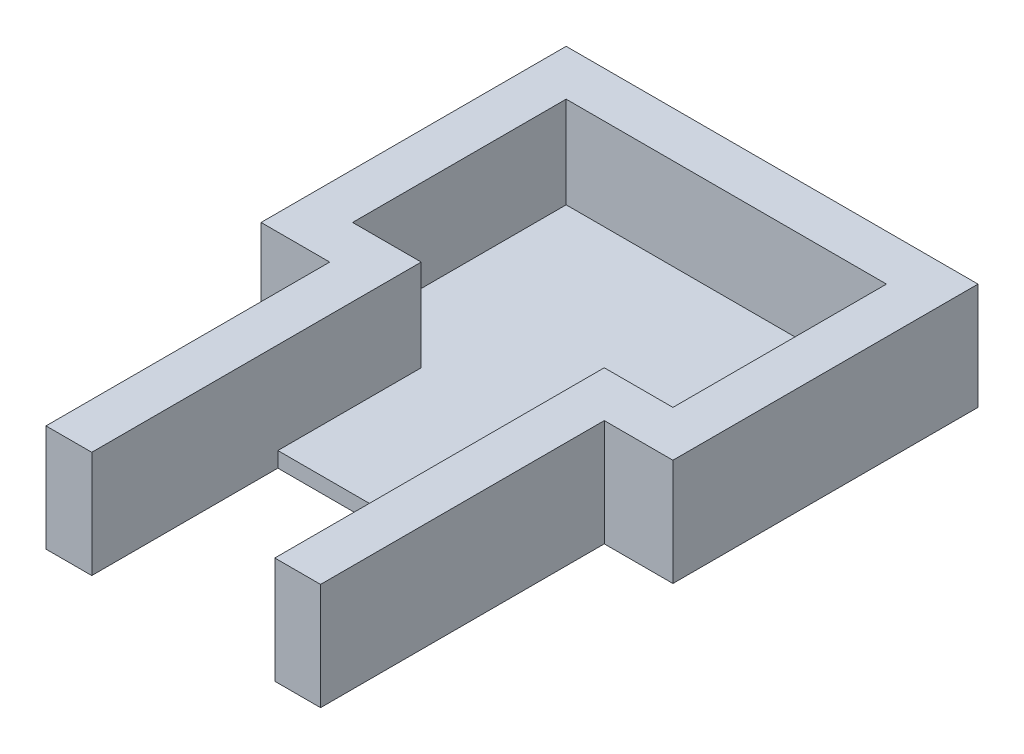
ISO-10303-21;
HEADER;
FILE_DESCRIPTION(('STEP AP214'),'2;1');
FILE_NAME('part.step','',(''),(''),'','','');
FILE_SCHEMA(('AUTOMOTIVE_DESIGN { 1 0 10303 214 1 1 1 1 }'));
ENDSEC;
DATA;
#1=APPLICATION_CONTEXT('core data for automotive mechanical design processes');
#2=APPLICATION_PROTOCOL_DEFINITION('international standard','automotive_design',2000,#1);
#3=PRODUCT_CONTEXT('',#1,'mechanical');
#4=PRODUCT('Part','Part','',(#3));
#5=PRODUCT_RELATED_PRODUCT_CATEGORY('part','',(#4));
#6=PRODUCT_DEFINITION_FORMATION('','',#4);
#7=PRODUCT_DEFINITION_CONTEXT('part definition',#1,'design');
#8=PRODUCT_DEFINITION('design','',#6,#7);
#9=PRODUCT_DEFINITION_SHAPE('','',#8);
#10=(LENGTH_UNIT() NAMED_UNIT(*) SI_UNIT(.MILLI.,.METRE.));
#11=(NAMED_UNIT(*) PLANE_ANGLE_UNIT() SI_UNIT($,.RADIAN.));
#12=(NAMED_UNIT(*) SI_UNIT($,.STERADIAN.) SOLID_ANGLE_UNIT());
#13=UNCERTAINTY_MEASURE_WITH_UNIT(LENGTH_MEASURE(1.E-05),#10,'distance_accuracy_value','');
#14=(GEOMETRIC_REPRESENTATION_CONTEXT(3) GLOBAL_UNCERTAINTY_ASSIGNED_CONTEXT((#13)) GLOBAL_UNIT_ASSIGNED_CONTEXT((#10,
#11,#12)) REPRESENTATION_CONTEXT('',''));
#15=CARTESIAN_POINT('',(0.,0.,0.));
#16=DIRECTION('',(0.,0.,1.));
#17=DIRECTION('',(1.,0.,0.));
#18=AXIS2_PLACEMENT_3D('',#15,#16,#17);
#19=CARTESIAN_POINT('',(45.,5.,143.));
#20=DIRECTION('',(0.,0.,-1.));
#21=DIRECTION('',(-1.,0.,0.));
#22=AXIS2_PLACEMENT_3D('',#19,#20,#21);
#23=PLANE('',#22);
#24=DIRECTION('',(0.,1.,0.));
#25=VECTOR('',#24,1.);
#26=CARTESIAN_POINT('',(-30.,0.,143.));
#27=LINE('',#26,#25);
#28=CARTESIAN_POINT('',(-30.,0.,143.));
#29=VERTEX_POINT('',#28);
#30=CARTESIAN_POINT('',(-30.,35.,143.));
#31=VERTEX_POINT('',#30);
#32=EDGE_CURVE('E201',#29,#31,#27,.T.);
#33=ORIENTED_EDGE('',*,*,#32,.T.);
#34=DIRECTION('',(1.,0.,0.));
#35=VECTOR('',#34,1.);
#36=CARTESIAN_POINT('',(-45.,35.,143.));
#37=LINE('',#36,#35);
#38=CARTESIAN_POINT('',(-45.,35.,143.));
#39=VERTEX_POINT('',#38);
#40=EDGE_CURVE('E288',#39,#31,#37,.T.);
#41=ORIENTED_EDGE('',*,*,#40,.F.);
#42=DIRECTION('',(0.,-1.,0.));
#43=VECTOR('',#42,1.);
#44=CARTESIAN_POINT('',(-45.,5.,143.));
#45=LINE('',#44,#43);
#46=CARTESIAN_POINT('',(-45.,0.,143.));
#47=VERTEX_POINT('',#46);
#48=EDGE_CURVE('E350',#39,#47,#45,.T.);
#49=ORIENTED_EDGE('',*,*,#48,.T.);
#50=DIRECTION('',(1.,0.,0.));
#51=VECTOR('',#50,1.);
#52=CARTESIAN_POINT('',(45.,0.,143.));
#53=LINE('',#52,#51);
#54=EDGE_CURVE('E314',#47,#29,#53,.T.);
#55=ORIENTED_EDGE('',*,*,#54,.T.);
#56=EDGE_LOOP('',(#33,#41,#49,#55));
#57=FACE_BOUND('',#56,.T.);
#58=ADVANCED_FACE('F43',(#57),#23,.F.);
#59=CARTESIAN_POINT('',(0.,5.,0.));
#60=DIRECTION('',(0.,1.,0.));
#61=DIRECTION('',(0.,0.,1.));
#62=AXIS2_PLACEMENT_3D('',#59,#60,#61);
#63=PLANE('',#62);
#64=DIRECTION('',(0.,0.,1.));
#65=VECTOR('',#64,1.);
#66=CARTESIAN_POINT('',(-30.,5.,35.));
#67=LINE('',#66,#65);
#68=CARTESIAN_POINT('',(-30.,5.,35.));
#69=VERTEX_POINT('',#68);
#70=CARTESIAN_POINT('',(-30.,5.,82.));
#71=VERTEX_POINT('',#70);
#72=EDGE_CURVE('E241',#69,#71,#67,.T.);
#73=ORIENTED_EDGE('',*,*,#72,.T.);
#74=DIRECTION('',(1.,0.,0.));
#75=VECTOR('',#74,1.);
#76=CARTESIAN_POINT('',(0.,5.,82.));
#77=LINE('',#76,#75);
#78=CARTESIAN_POINT('',(30.,5.,82.));
#79=VERTEX_POINT('',#78);
#80=EDGE_CURVE('E11',#71,#79,#77,.T.);
#81=ORIENTED_EDGE('',*,*,#80,.T.);
#82=DIRECTION('',(0.,0.,-1.));
#83=VECTOR('',#82,1.);
#84=CARTESIAN_POINT('',(30.,5.,128.));
#85=LINE('',#84,#83);
#86=CARTESIAN_POINT('',(30.,5.,35.));
#87=VERTEX_POINT('',#86);
#88=EDGE_CURVE('E185',#79,#87,#85,.T.);
#89=ORIENTED_EDGE('',*,*,#88,.T.);
#90=DIRECTION('',(1.,0.,0.));
#91=VECTOR('',#90,1.);
#92=CARTESIAN_POINT('',(30.,5.,35.));
#93=LINE('',#92,#91);
#94=CARTESIAN_POINT('',(52.5,5.,35.));
#95=VERTEX_POINT('',#94);
#96=EDGE_CURVE('E211',#87,#95,#93,.T.);
#97=ORIENTED_EDGE('',*,*,#96,.T.);
#98=DIRECTION('',(0.,0.,-1.));
#99=VECTOR('',#98,1.);
#100=CARTESIAN_POINT('',(52.5,5.,35.));
#101=LINE('',#100,#99);
#102=CARTESIAN_POINT('',(52.5,5.,-35.));
#103=VERTEX_POINT('',#102);
#104=EDGE_CURVE('E67',#95,#103,#101,.T.);
#105=ORIENTED_EDGE('',*,*,#104,.T.);
#106=DIRECTION('',(-1.,0.,0.));
#107=VECTOR('',#106,1.);
#108=CARTESIAN_POINT('',(52.5,5.,-35.));
#109=LINE('',#108,#107);
#110=CARTESIAN_POINT('',(-52.5,5.,-35.));
#111=VERTEX_POINT('',#110);
#112=EDGE_CURVE('E232',#103,#111,#109,.T.);
#113=ORIENTED_EDGE('',*,*,#112,.T.);
#114=DIRECTION('',(0.,0.,1.));
#115=VECTOR('',#114,1.);
#116=CARTESIAN_POINT('',(-52.5,5.,-35.));
#117=LINE('',#116,#115);
#118=CARTESIAN_POINT('',(-52.5,5.,35.));
#119=VERTEX_POINT('',#118);
#120=EDGE_CURVE('E235',#111,#119,#117,.T.);
#121=ORIENTED_EDGE('',*,*,#120,.T.);
#122=DIRECTION('',(1.,0.,0.));
#123=VECTOR('',#122,1.);
#124=CARTESIAN_POINT('',(-52.5,5.,35.));
#125=LINE('',#124,#123);
#126=EDGE_CURVE('E238',#119,#69,#125,.T.);
#127=ORIENTED_EDGE('',*,*,#126,.T.);
#128=EDGE_LOOP('',(#73,#81,#89,#97,#105,#113,#121,#127));
#129=FACE_BOUND('',#128,.T.);
#130=ADVANCED_FACE('F413',(#129),#63,.T.);
#131=CARTESIAN_POINT('',(-67.5,5.,50.));
#132=DIRECTION('',(1.,0.,0.));
#133=DIRECTION('',(0.,0.,-1.));
#134=AXIS2_PLACEMENT_3D('',#131,#132,#133);
#135=PLANE('',#134);
#136=DIRECTION('',(0.,0.,1.));
#137=VECTOR('',#136,1.);
#138=CARTESIAN_POINT('',(-67.5,0.,50.));
#139=LINE('',#138,#137);
#140=CARTESIAN_POINT('',(-67.5,0.,-50.));
#141=VERTEX_POINT('',#140);
#142=CARTESIAN_POINT('',(-67.5,0.,50.));
#143=VERTEX_POINT('',#142);
#144=EDGE_CURVE('E304',#141,#143,#139,.T.);
#145=ORIENTED_EDGE('',*,*,#144,.T.);
#146=DIRECTION('',(0.,-1.,0.));
#147=VECTOR('',#146,1.);
#148=CARTESIAN_POINT('',(-67.5,5.,50.));
#149=LINE('',#148,#147);
#150=CARTESIAN_POINT('',(-67.5,35.,50.));
#151=VERTEX_POINT('',#150);
#152=EDGE_CURVE('E52',#151,#143,#149,.T.);
#153=ORIENTED_EDGE('',*,*,#152,.F.);
#154=DIRECTION('',(0.,0.,1.));
#155=VECTOR('',#154,1.);
#156=CARTESIAN_POINT('',(-67.5,35.,-50.));
#157=LINE('',#156,#155);
#158=CARTESIAN_POINT('',(-67.5,35.,-50.));
#159=VERTEX_POINT('',#158);
#160=EDGE_CURVE('E275',#159,#151,#157,.T.);
#161=ORIENTED_EDGE('',*,*,#160,.F.);
#162=DIRECTION('',(0.,-1.,0.));
#163=VECTOR('',#162,1.);
#164=CARTESIAN_POINT('',(-67.5,5.,-50.));
#165=LINE('',#164,#163);
#166=EDGE_CURVE('E330',#159,#141,#165,.T.);
#167=ORIENTED_EDGE('',*,*,#166,.T.);
#168=EDGE_LOOP('',(#145,#153,#161,#167));
#169=FACE_BOUND('',#168,.T.);
#170=ADVANCED_FACE('F45',(#169),#135,.F.);
#171=CARTESIAN_POINT('',(-45.,5.,50.));
#172=DIRECTION('',(0.,0.,-1.));
#173=DIRECTION('',(-1.,0.,0.));
#174=AXIS2_PLACEMENT_3D('',#171,#172,#173);
#175=PLANE('',#174);
#176=DIRECTION('',(1.,0.,0.));
#177=VECTOR('',#176,1.);
#178=CARTESIAN_POINT('',(-45.,0.,50.));
#179=LINE('',#178,#177);
#180=CARTESIAN_POINT('',(-45.,0.,50.));
#181=VERTEX_POINT('',#180);
#182=EDGE_CURVE('E308',#143,#181,#179,.T.);
#183=ORIENTED_EDGE('',*,*,#182,.T.);
#184=DIRECTION('',(0.,-1.,0.));
#185=VECTOR('',#184,1.);
#186=CARTESIAN_POINT('',(-45.,5.,50.));
#187=LINE('',#186,#185);
#188=CARTESIAN_POINT('',(-45.,35.,50.));
#189=VERTEX_POINT('',#188);
#190=EDGE_CURVE('E354',#189,#181,#187,.T.);
#191=ORIENTED_EDGE('',*,*,#190,.F.);
#192=DIRECTION('',(1.,0.,0.));
#193=VECTOR('',#192,1.);
#194=CARTESIAN_POINT('',(-67.5,35.,50.));
#195=LINE('',#194,#193);
#196=EDGE_CURVE('E279',#151,#189,#195,.T.);
#197=ORIENTED_EDGE('',*,*,#196,.F.);
#198=ORIENTED_EDGE('',*,*,#152,.T.);
#199=EDGE_LOOP('',(#183,#191,#197,#198));
#200=FACE_BOUND('',#199,.T.);
#201=ADVANCED_FACE('F361',(#200),#175,.F.);
#202=CARTESIAN_POINT('',(-45.,5.,143.));
#203=DIRECTION('',(1.,0.,0.));
#204=DIRECTION('',(0.,0.,-1.));
#205=AXIS2_PLACEMENT_3D('',#202,#203,#204);
#206=PLANE('',#205);
#207=DIRECTION('',(0.,0.,1.));
#208=VECTOR('',#207,1.);
#209=CARTESIAN_POINT('',(-45.,0.,143.));
#210=LINE('',#209,#208);
#211=EDGE_CURVE('E311',#181,#47,#210,.T.);
#212=ORIENTED_EDGE('',*,*,#211,.T.);
#213=ORIENTED_EDGE('',*,*,#48,.F.);
#214=DIRECTION('',(0.,0.,1.));
#215=VECTOR('',#214,1.);
#216=CARTESIAN_POINT('',(-45.,35.,50.));
#217=LINE('',#216,#215);
#218=EDGE_CURVE('E283',#189,#39,#217,.T.);
#219=ORIENTED_EDGE('',*,*,#218,.F.);
#220=ORIENTED_EDGE('',*,*,#190,.T.);
#221=EDGE_LOOP('',(#212,#213,#219,#220));
#222=FACE_BOUND('',#221,.T.);
#223=ADVANCED_FACE('F370',(#222),#206,.F.);
#224=CARTESIAN_POINT('',(30.,35.,143.));
#225=VERTEX_POINT('',#224);
#226=CARTESIAN_POINT('',(45.,35.,143.));
#227=VERTEX_POINT('',#226);
#228=EDGE_CURVE('E287',#225,#227,#37,.T.);
#229=ORIENTED_EDGE('',*,*,#228,.F.);
#230=DIRECTION('',(0.,1.,0.));
#231=VECTOR('',#230,1.);
#232=CARTESIAN_POINT('',(30.,0.,143.));
#233=LINE('',#232,#231);
#234=CARTESIAN_POINT('',(30.,0.,143.));
#235=VERTEX_POINT('',#234);
#236=EDGE_CURVE('E187',#235,#225,#233,.T.);
#237=ORIENTED_EDGE('',*,*,#236,.F.);
#238=CARTESIAN_POINT('',(45.,0.,143.));
#239=VERTEX_POINT('',#238);
#240=EDGE_CURVE('E192',#235,#239,#53,.T.);
#241=ORIENTED_EDGE('',*,*,#240,.T.);
#242=DIRECTION('',(0.,-1.,0.));
#243=VECTOR('',#242,1.);
#244=CARTESIAN_POINT('',(45.,5.,143.));
#245=LINE('',#244,#243);
#246=EDGE_CURVE('E346',#227,#239,#245,.T.);
#247=ORIENTED_EDGE('',*,*,#246,.F.);
#248=EDGE_LOOP('',(#229,#237,#241,#247));
#249=FACE_BOUND('',#248,.T.);
#250=ADVANCED_FACE('F396',(#249),#23,.F.);
#251=CARTESIAN_POINT('',(45.,5.,143.));
#252=DIRECTION('',(-1.,0.,0.));
#253=DIRECTION('',(0.,0.,1.));
#254=AXIS2_PLACEMENT_3D('',#251,#252,#253);
#255=PLANE('',#254);
#256=DIRECTION('',(0.,0.,-1.));
#257=VECTOR('',#256,1.);
#258=CARTESIAN_POINT('',(45.,0.,143.));
#259=LINE('',#258,#257);
#260=CARTESIAN_POINT('',(45.,0.,50.));
#261=VERTEX_POINT('',#260);
#262=EDGE_CURVE('E318',#239,#261,#259,.T.);
#263=ORIENTED_EDGE('',*,*,#262,.T.);
#264=DIRECTION('',(0.,-1.,0.));
#265=VECTOR('',#264,1.);
#266=CARTESIAN_POINT('',(45.,5.,50.));
#267=LINE('',#266,#265);
#268=CARTESIAN_POINT('',(45.,35.,50.));
#269=VERTEX_POINT('',#268);
#270=EDGE_CURVE('E342',#269,#261,#267,.T.);
#271=ORIENTED_EDGE('',*,*,#270,.F.);
#272=DIRECTION('',(0.,0.,-1.));
#273=VECTOR('',#272,1.);
#274=CARTESIAN_POINT('',(45.,35.,143.));
#275=LINE('',#274,#273);
#276=EDGE_CURVE('E292',#227,#269,#275,.T.);
#277=ORIENTED_EDGE('',*,*,#276,.F.);
#278=ORIENTED_EDGE('',*,*,#246,.T.);
#279=EDGE_LOOP('',(#263,#271,#277,#278));
#280=FACE_BOUND('',#279,.T.);
#281=ADVANCED_FACE('F390',(#280),#255,.F.);
#282=CARTESIAN_POINT('',(67.5,5.,50.));
#283=DIRECTION('',(0.,0.,-1.));
#284=DIRECTION('',(-1.,0.,0.));
#285=AXIS2_PLACEMENT_3D('',#282,#283,#284);
#286=PLANE('',#285);
#287=DIRECTION('',(1.,0.,0.));
#288=VECTOR('',#287,1.);
#289=CARTESIAN_POINT('',(67.5,0.,50.));
#290=LINE('',#289,#288);
#291=CARTESIAN_POINT('',(67.5,0.,50.));
#292=VERTEX_POINT('',#291);
#293=EDGE_CURVE('E321',#261,#292,#290,.T.);
#294=ORIENTED_EDGE('',*,*,#293,.T.);
#295=DIRECTION('',(0.,-1.,0.));
#296=VECTOR('',#295,1.);
#297=CARTESIAN_POINT('',(67.5,5.,50.));
#298=LINE('',#297,#296);
#299=CARTESIAN_POINT('',(67.5,35.,50.));
#300=VERTEX_POINT('',#299);
#301=EDGE_CURVE('E338',#300,#292,#298,.T.);
#302=ORIENTED_EDGE('',*,*,#301,.F.);
#303=DIRECTION('',(1.,0.,0.));
#304=VECTOR('',#303,1.);
#305=CARTESIAN_POINT('',(45.,35.,50.));
#306=LINE('',#305,#304);
#307=EDGE_CURVE('E296',#269,#300,#306,.T.);
#308=ORIENTED_EDGE('',*,*,#307,.F.);
#309=ORIENTED_EDGE('',*,*,#270,.T.);
#310=EDGE_LOOP('',(#294,#302,#308,#309));
#311=FACE_BOUND('',#310,.T.);
#312=ADVANCED_FACE('F386',(#311),#286,.F.);
#313=CARTESIAN_POINT('',(67.5,5.,50.));
#314=DIRECTION('',(-1.,0.,0.));
#315=DIRECTION('',(0.,0.,1.));
#316=AXIS2_PLACEMENT_3D('',#313,#314,#315);
#317=PLANE('',#316);
#318=DIRECTION('',(0.,0.,-1.));
#319=VECTOR('',#318,1.);
#320=CARTESIAN_POINT('',(67.5,0.,50.));
#321=LINE('',#320,#319);
#322=CARTESIAN_POINT('',(67.5,0.,-50.));
#323=VERTEX_POINT('',#322);
#324=EDGE_CURVE('E324',#292,#323,#321,.T.);
#325=ORIENTED_EDGE('',*,*,#324,.T.);
#326=DIRECTION('',(0.,-1.,0.));
#327=VECTOR('',#326,1.);
#328=CARTESIAN_POINT('',(67.5,5.,-50.));
#329=LINE('',#328,#327);
#330=CARTESIAN_POINT('',(67.5,35.,-50.));
#331=VERTEX_POINT('',#330);
#332=EDGE_CURVE('E334',#331,#323,#329,.T.);
#333=ORIENTED_EDGE('',*,*,#332,.F.);
#334=DIRECTION('',(0.,0.,-1.));
#335=VECTOR('',#334,1.);
#336=CARTESIAN_POINT('',(67.5,35.,50.));
#337=LINE('',#336,#335);
#338=EDGE_CURVE('E300',#300,#331,#337,.T.);
#339=ORIENTED_EDGE('',*,*,#338,.F.);
#340=ORIENTED_EDGE('',*,*,#301,.T.);
#341=EDGE_LOOP('',(#325,#333,#339,#340));
#342=FACE_BOUND('',#341,.T.);
#343=ADVANCED_FACE('F383',(#342),#317,.F.);
#344=CARTESIAN_POINT('',(67.5,5.,-50.));
#345=DIRECTION('',(0.,0.,1.));
#346=DIRECTION('',(1.,0.,0.));
#347=AXIS2_PLACEMENT_3D('',#344,#345,#346);
#348=PLANE('',#347);
#349=DIRECTION('',(-1.,0.,0.));
#350=VECTOR('',#349,1.);
#351=CARTESIAN_POINT('',(67.5,0.,-50.));
#352=LINE('',#351,#350);
#353=EDGE_CURVE('E327',#323,#141,#352,.T.);
#354=ORIENTED_EDGE('',*,*,#353,.T.);
#355=ORIENTED_EDGE('',*,*,#166,.F.);
#356=DIRECTION('',(-1.,0.,0.));
#357=VECTOR('',#356,1.);
#358=CARTESIAN_POINT('',(67.5,35.,-50.));
#359=LINE('',#358,#357);
#360=EDGE_CURVE('E271',#331,#159,#359,.T.);
#361=ORIENTED_EDGE('',*,*,#360,.F.);
#362=ORIENTED_EDGE('',*,*,#332,.T.);
#363=EDGE_LOOP('',(#354,#355,#361,#362));
#364=FACE_BOUND('',#363,.T.);
#365=ADVANCED_FACE('F381',(#364),#348,.F.);
#366=CARTESIAN_POINT('',(0.,0.,0.));
#367=DIRECTION('',(0.,1.,0.));
#368=DIRECTION('',(0.,0.,1.));
#369=AXIS2_PLACEMENT_3D('',#366,#367,#368);
#370=PLANE('',#369);
#371=ORIENTED_EDGE('',*,*,#240,.F.);
#372=DIRECTION('',(0.,0.,-1.));
#373=VECTOR('',#372,1.);
#374=CARTESIAN_POINT('',(30.,0.,143.));
#375=LINE('',#374,#373);
#376=CARTESIAN_POINT('',(30.,0.,82.));
#377=VERTEX_POINT('',#376);
#378=EDGE_CURVE('E177',#235,#377,#375,.T.);
#379=ORIENTED_EDGE('',*,*,#378,.T.);
#380=DIRECTION('',(1.,0.,0.));
#381=VECTOR('',#380,1.);
#382=CARTESIAN_POINT('',(-30.,0.,82.));
#383=LINE('',#382,#381);
#384=CARTESIAN_POINT('',(-30.,0.,82.));
#385=VERTEX_POINT('',#384);
#386=EDGE_CURVE('E169',#385,#377,#383,.T.);
#387=ORIENTED_EDGE('',*,*,#386,.F.);
#388=DIRECTION('',(0.,0.,-1.));
#389=VECTOR('',#388,1.);
#390=CARTESIAN_POINT('',(-30.,0.,143.));
#391=LINE('',#390,#389);
#392=EDGE_CURVE('E194',#29,#385,#391,.T.);
#393=ORIENTED_EDGE('',*,*,#392,.F.);
#394=ORIENTED_EDGE('',*,*,#54,.F.);
#395=ORIENTED_EDGE('',*,*,#211,.F.);
#396=ORIENTED_EDGE('',*,*,#182,.F.);
#397=ORIENTED_EDGE('',*,*,#144,.F.);
#398=ORIENTED_EDGE('',*,*,#353,.F.);
#399=ORIENTED_EDGE('',*,*,#324,.F.);
#400=ORIENTED_EDGE('',*,*,#293,.F.);
#401=ORIENTED_EDGE('',*,*,#262,.F.);
#402=EDGE_LOOP('',(#371,#379,#387,#393,#394,#395,#396,#397,#398,#399,#400,#401));
#403=FACE_BOUND('',#402,.T.);
#404=ADVANCED_FACE('F190',(#403),#370,.F.);
#405=CARTESIAN_POINT('',(0.,35.,0.));
#406=DIRECTION('',(0.,1.,0.));
#407=DIRECTION('',(0.,0.,1.));
#408=AXIS2_PLACEMENT_3D('',#405,#406,#407);
#409=PLANE('',#408);
#410=DIRECTION('',(0.,0.,-1.));
#411=VECTOR('',#410,1.);
#412=CARTESIAN_POINT('',(30.,35.,128.));
#413=LINE('',#412,#411);
#414=CARTESIAN_POINT('',(30.,35.,35.));
#415=VERTEX_POINT('',#414);
#416=EDGE_CURVE('E223',#225,#415,#413,.T.);
#417=ORIENTED_EDGE('',*,*,#416,.F.);
#418=ORIENTED_EDGE('',*,*,#228,.T.);
#419=ORIENTED_EDGE('',*,*,#276,.T.);
#420=ORIENTED_EDGE('',*,*,#307,.T.);
#421=ORIENTED_EDGE('',*,*,#338,.T.);
#422=ORIENTED_EDGE('',*,*,#360,.T.);
#423=ORIENTED_EDGE('',*,*,#160,.T.);
#424=ORIENTED_EDGE('',*,*,#196,.T.);
#425=ORIENTED_EDGE('',*,*,#218,.T.);
#426=ORIENTED_EDGE('',*,*,#40,.T.);
#427=DIRECTION('',(0.,0.,1.));
#428=VECTOR('',#427,1.);
#429=CARTESIAN_POINT('',(-30.,35.,35.));
#430=LINE('',#429,#428);
#431=CARTESIAN_POINT('',(-30.,35.,35.));
#432=VERTEX_POINT('',#431);
#433=EDGE_CURVE('E220',#432,#31,#430,.T.);
#434=ORIENTED_EDGE('',*,*,#433,.F.);
#435=DIRECTION('',(1.,0.,0.));
#436=VECTOR('',#435,1.);
#437=CARTESIAN_POINT('',(-52.5,35.,35.));
#438=LINE('',#437,#436);
#439=CARTESIAN_POINT('',(-52.5,35.,35.));
#440=VERTEX_POINT('',#439);
#441=EDGE_CURVE('E217',#440,#432,#438,.T.);
#442=ORIENTED_EDGE('',*,*,#441,.F.);
#443=DIRECTION('',(0.,0.,1.));
#444=VECTOR('',#443,1.);
#445=CARTESIAN_POINT('',(-52.5,35.,-35.));
#446=LINE('',#445,#444);
#447=CARTESIAN_POINT('',(-52.5,35.,-35.));
#448=VERTEX_POINT('',#447);
#449=EDGE_CURVE('E214',#448,#440,#446,.T.);
#450=ORIENTED_EDGE('',*,*,#449,.F.);
#451=DIRECTION('',(-1.,0.,0.));
#452=VECTOR('',#451,1.);
#453=CARTESIAN_POINT('',(52.5,35.,-35.));
#454=LINE('',#453,#452);
#455=CARTESIAN_POINT('',(52.5,35.,-35.));
#456=VERTEX_POINT('',#455);
#457=EDGE_CURVE('E210',#456,#448,#454,.T.);
#458=ORIENTED_EDGE('',*,*,#457,.F.);
#459=DIRECTION('',(0.,0.,-1.));
#460=VECTOR('',#459,1.);
#461=CARTESIAN_POINT('',(52.5,35.,35.));
#462=LINE('',#461,#460);
#463=CARTESIAN_POINT('',(52.5,35.,35.));
#464=VERTEX_POINT('',#463);
#465=EDGE_CURVE('E207',#464,#456,#462,.T.);
#466=ORIENTED_EDGE('',*,*,#465,.F.);
#467=DIRECTION('',(1.,0.,0.));
#468=VECTOR('',#467,1.);
#469=CARTESIAN_POINT('',(30.,35.,35.));
#470=LINE('',#469,#468);
#471=EDGE_CURVE('E226',#415,#464,#470,.T.);
#472=ORIENTED_EDGE('',*,*,#471,.F.);
#473=EDGE_LOOP('',(#417,#418,#419,#420,#421,#422,#423,#424,#425,#426,#434,#442,#450,#458,#466,#472));
#474=FACE_BOUND('',#473,.T.);
#475=ADVANCED_FACE('F376',(#474),#409,.T.);
#476=CARTESIAN_POINT('',(52.5,35.,35.));
#477=DIRECTION('',(-1.,0.,0.));
#478=DIRECTION('',(0.,0.,1.));
#479=AXIS2_PLACEMENT_3D('',#476,#477,#478);
#480=PLANE('',#479);
#481=ORIENTED_EDGE('',*,*,#104,.F.);
#482=DIRECTION('',(0.,-1.,0.));
#483=VECTOR('',#482,1.);
#484=CARTESIAN_POINT('',(52.5,35.,35.));
#485=LINE('',#484,#483);
#486=EDGE_CURVE('E229',#464,#95,#485,.T.);
#487=ORIENTED_EDGE('',*,*,#486,.F.);
#488=ORIENTED_EDGE('',*,*,#465,.T.);
#489=DIRECTION('',(0.,-1.,0.));
#490=VECTOR('',#489,1.);
#491=CARTESIAN_POINT('',(52.5,35.,-35.));
#492=LINE('',#491,#490);
#493=EDGE_CURVE('E267',#456,#103,#492,.T.);
#494=ORIENTED_EDGE('',*,*,#493,.T.);
#495=EDGE_LOOP('',(#481,#487,#488,#494));
#496=FACE_BOUND('',#495,.T.);
#497=ADVANCED_FACE('F408',(#496),#480,.T.);
#498=CARTESIAN_POINT('',(52.5,35.,-35.));
#499=DIRECTION('',(0.,0.,1.));
#500=DIRECTION('',(1.,0.,0.));
#501=AXIS2_PLACEMENT_3D('',#498,#499,#500);
#502=PLANE('',#501);
#503=ORIENTED_EDGE('',*,*,#112,.F.);
#504=ORIENTED_EDGE('',*,*,#493,.F.);
#505=ORIENTED_EDGE('',*,*,#457,.T.);
#506=DIRECTION('',(0.,-1.,0.));
#507=VECTOR('',#506,1.);
#508=CARTESIAN_POINT('',(-52.5,35.,-35.));
#509=LINE('',#508,#507);
#510=EDGE_CURVE('E263',#448,#111,#509,.T.);
#511=ORIENTED_EDGE('',*,*,#510,.T.);
#512=EDGE_LOOP('',(#503,#504,#505,#511));
#513=FACE_BOUND('',#512,.T.);
#514=ADVANCED_FACE('F410',(#513),#502,.T.);
#515=CARTESIAN_POINT('',(-52.5,35.,-35.));
#516=DIRECTION('',(1.,0.,0.));
#517=DIRECTION('',(0.,0.,-1.));
#518=AXIS2_PLACEMENT_3D('',#515,#516,#517);
#519=PLANE('',#518);
#520=ORIENTED_EDGE('',*,*,#120,.F.);
#521=ORIENTED_EDGE('',*,*,#510,.F.);
#522=ORIENTED_EDGE('',*,*,#449,.T.);
#523=DIRECTION('',(0.,-1.,0.));
#524=VECTOR('',#523,1.);
#525=CARTESIAN_POINT('',(-52.5,35.,35.));
#526=LINE('',#525,#524);
#527=EDGE_CURVE('E259',#440,#119,#526,.T.);
#528=ORIENTED_EDGE('',*,*,#527,.T.);
#529=EDGE_LOOP('',(#520,#521,#522,#528));
#530=FACE_BOUND('',#529,.T.);
#531=ADVANCED_FACE('F417',(#530),#519,.T.);
#532=CARTESIAN_POINT('',(-52.5,35.,35.));
#533=DIRECTION('',(0.,0.,-1.));
#534=DIRECTION('',(-1.,0.,0.));
#535=AXIS2_PLACEMENT_3D('',#532,#533,#534);
#536=PLANE('',#535);
#537=ORIENTED_EDGE('',*,*,#126,.F.);
#538=ORIENTED_EDGE('',*,*,#527,.F.);
#539=ORIENTED_EDGE('',*,*,#441,.T.);
#540=DIRECTION('',(0.,-1.,0.));
#541=VECTOR('',#540,1.);
#542=CARTESIAN_POINT('',(-30.,35.,35.));
#543=LINE('',#542,#541);
#544=EDGE_CURVE('E255',#432,#69,#543,.T.);
#545=ORIENTED_EDGE('',*,*,#544,.T.);
#546=EDGE_LOOP('',(#537,#538,#539,#545));
#547=FACE_BOUND('',#546,.T.);
#548=ADVANCED_FACE('F419',(#547),#536,.T.);
#549=CARTESIAN_POINT('',(-30.,35.,35.));
#550=DIRECTION('',(1.,0.,0.));
#551=DIRECTION('',(0.,0.,-1.));
#552=AXIS2_PLACEMENT_3D('',#549,#550,#551);
#553=PLANE('',#552);
#554=DIRECTION('',(0.,1.,0.));
#555=VECTOR('',#554,1.);
#556=CARTESIAN_POINT('',(-30.,0.,82.));
#557=LINE('',#556,#555);
#558=EDGE_CURVE('E59',#385,#71,#557,.T.);
#559=ORIENTED_EDGE('',*,*,#558,.T.);
#560=ORIENTED_EDGE('',*,*,#72,.F.);
#561=ORIENTED_EDGE('',*,*,#544,.F.);
#562=ORIENTED_EDGE('',*,*,#433,.T.);
#563=ORIENTED_EDGE('',*,*,#32,.F.);
#564=ORIENTED_EDGE('',*,*,#392,.T.);
#565=EDGE_LOOP('',(#559,#560,#561,#562,#563,#564));
#566=FACE_BOUND('',#565,.T.);
#567=ADVANCED_FACE('F421',(#566),#553,.T.);
#568=CARTESIAN_POINT('',(30.,35.,128.));
#569=DIRECTION('',(-1.,0.,0.));
#570=DIRECTION('',(0.,0.,1.));
#571=AXIS2_PLACEMENT_3D('',#568,#569,#570);
#572=PLANE('',#571);
#573=ORIENTED_EDGE('',*,*,#416,.T.);
#574=DIRECTION('',(0.,-1.,0.));
#575=VECTOR('',#574,1.);
#576=CARTESIAN_POINT('',(30.,35.,35.));
#577=LINE('',#576,#575);
#578=EDGE_CURVE('E252',#415,#87,#577,.T.);
#579=ORIENTED_EDGE('',*,*,#578,.T.);
#580=ORIENTED_EDGE('',*,*,#88,.F.);
#581=DIRECTION('',(0.,1.,0.));
#582=VECTOR('',#581,1.);
#583=CARTESIAN_POINT('',(30.,0.,82.));
#584=LINE('',#583,#582);
#585=EDGE_CURVE('E172',#377,#79,#584,.T.);
#586=ORIENTED_EDGE('',*,*,#585,.F.);
#587=ORIENTED_EDGE('',*,*,#378,.F.);
#588=ORIENTED_EDGE('',*,*,#236,.T.);
#589=EDGE_LOOP('',(#573,#579,#580,#586,#587,#588));
#590=FACE_BOUND('',#589,.T.);
#591=ADVANCED_FACE('F181',(#590),#572,.T.);
#592=CARTESIAN_POINT('',(30.,35.,35.));
#593=DIRECTION('',(0.,0.,-1.));
#594=DIRECTION('',(-1.,0.,0.));
#595=AXIS2_PLACEMENT_3D('',#592,#593,#594);
#596=PLANE('',#595);
#597=ORIENTED_EDGE('',*,*,#96,.F.);
#598=ORIENTED_EDGE('',*,*,#578,.F.);
#599=ORIENTED_EDGE('',*,*,#471,.T.);
#600=ORIENTED_EDGE('',*,*,#486,.T.);
#601=EDGE_LOOP('',(#597,#598,#599,#600));
#602=FACE_BOUND('',#601,.T.);
#603=ADVANCED_FACE('F401',(#602),#596,.T.);
#604=CARTESIAN_POINT('',(-30.,0.,82.));
#605=DIRECTION('',(0.,0.,1.));
#606=DIRECTION('',(1.,0.,0.));
#607=AXIS2_PLACEMENT_3D('',#604,#605,#606);
#608=PLANE('',#607);
#609=ORIENTED_EDGE('',*,*,#558,.F.);
#610=ORIENTED_EDGE('',*,*,#386,.T.);
#611=ORIENTED_EDGE('',*,*,#585,.T.);
#612=ORIENTED_EDGE('',*,*,#80,.F.);
#613=EDGE_LOOP('',(#609,#610,#611,#612));
#614=FACE_BOUND('',#613,.T.);
#615=ADVANCED_FACE('F171',(#614),#608,.T.);
#616=CLOSED_SHELL('',(#58,#130,#170,#201,#223,#250,#281,#312,#343,#365,#404,#475,#497,#514,#531,
#548,#567,#591,#603,#615));
#617=MANIFOLD_SOLID_BREP('B2',#616);
#618=ADVANCED_BREP_SHAPE_REPRESENTATION('',(#18,#617),#14);
#619=SHAPE_DEFINITION_REPRESENTATION(#9,#618);
ENDSEC;
END-ISO-10303-21;
